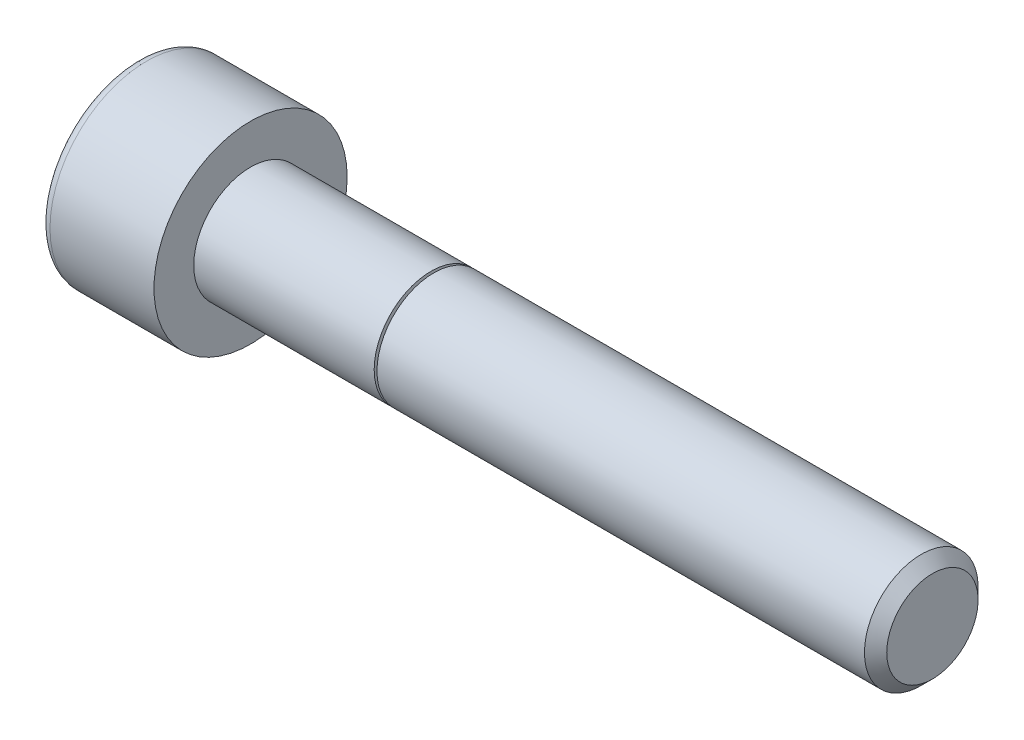
ISO-10303-21;
HEADER;
FILE_DESCRIPTION(('STEP AP214'),'2;1');
FILE_NAME('part.step','',(''),(''),'','','');
FILE_SCHEMA(('AUTOMOTIVE_DESIGN { 1 0 10303 214 1 1 1 1 }'));
ENDSEC;
DATA;
#1=APPLICATION_CONTEXT('core data for automotive mechanical design processes');
#2=APPLICATION_PROTOCOL_DEFINITION('international standard','automotive_design',2000,#1);
#3=PRODUCT_CONTEXT('',#1,'mechanical');
#4=PRODUCT('Part','Part','',(#3));
#5=PRODUCT_RELATED_PRODUCT_CATEGORY('part','',(#4));
#6=PRODUCT_DEFINITION_FORMATION('','',#4);
#7=PRODUCT_DEFINITION_CONTEXT('part definition',#1,'design');
#8=PRODUCT_DEFINITION('design','',#6,#7);
#9=PRODUCT_DEFINITION_SHAPE('','',#8);
#10=(LENGTH_UNIT() NAMED_UNIT(*) SI_UNIT(.MILLI.,.METRE.));
#11=(NAMED_UNIT(*) PLANE_ANGLE_UNIT() SI_UNIT($,.RADIAN.));
#12=(NAMED_UNIT(*) SI_UNIT($,.STERADIAN.) SOLID_ANGLE_UNIT());
#13=UNCERTAINTY_MEASURE_WITH_UNIT(LENGTH_MEASURE(1.E-05),#10,'distance_accuracy_value','');
#14=(GEOMETRIC_REPRESENTATION_CONTEXT(3) GLOBAL_UNCERTAINTY_ASSIGNED_CONTEXT((#13)) GLOBAL_UNIT_ASSIGNED_CONTEXT((#10,
#11,#12)) REPRESENTATION_CONTEXT('',''));
#15=CARTESIAN_POINT('',(0.,0.,0.));
#16=DIRECTION('',(0.,0.,1.));
#17=DIRECTION('',(1.,0.,0.));
#18=AXIS2_PLACEMENT_3D('',#15,#16,#17);
#19=CARTESIAN_POINT('',(30.,-2.04969,2.0095));
#20=DIRECTION('',(1.,0.,0.));
#21=DIRECTION('',(0.,0.,-1.));
#22=AXIS2_PLACEMENT_3D('',#19,#20,#21);
#23=PLANE('',#22);
#24=CARTESIAN_POINT('',(30.,0.,0.));
#25=DIRECTION('',(-1.,0.,0.));
#26=DIRECTION('',(0.,0.,1.));
#27=AXIS2_PLACEMENT_3D('',#24,#25,#26);
#28=CIRCLE('',#27,2.0095);
#29=CARTESIAN_POINT('',(30.,0.,2.0095));
#30=VERTEX_POINT('',#29);
#31=EDGE_CURVE('E20',#30,#30,#28,.T.);
#32=ORIENTED_EDGE('',*,*,#31,.F.);
#33=EDGE_LOOP('',(#32));
#34=FACE_BOUND('',#33,.T.);
#35=ADVANCED_FACE('F16',(#34),#23,.T.);
#36=CARTESIAN_POINT('',(30.,0.,0.));
#37=DIRECTION('',(-1.,0.,0.));
#38=DIRECTION('',(0.,0.,1.));
#39=AXIS2_PLACEMENT_3D('',#36,#37,#38);
#40=CONICAL_SURFACE('',#39,2.0095,0.78539816339745);
#41=ORIENTED_EDGE('',*,*,#31,.T.);
#42=EDGE_LOOP('',(#41));
#43=FACE_BOUND('',#42,.T.);
#44=CARTESIAN_POINT('',(29.5095,0.,0.));
#45=DIRECTION('',(-1.,0.,0.));
#46=DIRECTION('',(0.,0.,1.));
#47=AXIS2_PLACEMENT_3D('',#44,#45,#46);
#48=CIRCLE('',#47,2.5);
#49=CARTESIAN_POINT('',(29.5095,0.,2.5));
#50=VERTEX_POINT('',#49);
#51=EDGE_CURVE('E122',#50,#50,#48,.T.);
#52=ORIENTED_EDGE('',*,*,#51,.F.);
#53=EDGE_LOOP('',(#52));
#54=FACE_BOUND('',#53,.T.);
#55=ADVANCED_FACE('F235',(#43,#54),#40,.T.);
#56=CARTESIAN_POINT('',(29.5095,0.,0.));
#57=DIRECTION('',(-1.,0.,0.));
#58=DIRECTION('',(0.,0.,1.));
#59=AXIS2_PLACEMENT_3D('',#56,#57,#58);
#60=CYLINDRICAL_SURFACE('',#59,2.5);
#61=CARTESIAN_POINT('',(8.0613125,0.,0.));
#62=DIRECTION('',(-1.,0.,0.));
#63=DIRECTION('',(0.,0.,1.));
#64=AXIS2_PLACEMENT_3D('',#61,#62,#63);
#65=CIRCLE('',#64,2.5);
#66=CARTESIAN_POINT('',(8.0613125,0.,2.5));
#67=VERTEX_POINT('',#66);
#68=EDGE_CURVE('E119',#67,#67,#65,.T.);
#69=ORIENTED_EDGE('',*,*,#68,.F.);
#70=EDGE_LOOP('',(#69));
#71=FACE_BOUND('',#70,.T.);
#72=ORIENTED_EDGE('',*,*,#51,.T.);
#73=EDGE_LOOP('',(#72));
#74=FACE_BOUND('',#73,.T.);
#75=ADVANCED_FACE('F229',(#71,#74),#60,.T.);
#76=CARTESIAN_POINT('',(8.,0.,0.));
#77=DIRECTION('',(1.,0.,0.));
#78=DIRECTION('',(0.,0.,-1.));
#79=AXIS2_PLACEMENT_3D('',#76,#77,#78);
#80=CONICAL_SURFACE('',#79,2.0095,1.44644133224814);
#81=CARTESIAN_POINT('',(8.,0.,0.));
#82=DIRECTION('',(-1.,0.,0.));
#83=DIRECTION('',(0.,0.,1.));
#84=AXIS2_PLACEMENT_3D('',#81,#82,#83);
#85=CIRCLE('',#84,2.0095);
#86=CARTESIAN_POINT('',(8.,0.,2.0095));
#87=VERTEX_POINT('',#86);
#88=EDGE_CURVE('E116',#87,#87,#85,.T.);
#89=ORIENTED_EDGE('',*,*,#88,.F.);
#90=EDGE_LOOP('',(#89));
#91=FACE_BOUND('',#90,.T.);
#92=ORIENTED_EDGE('',*,*,#68,.T.);
#93=EDGE_LOOP('',(#92));
#94=FACE_BOUND('',#93,.T.);
#95=ADVANCED_FACE('F223',(#91,#94),#80,.T.);
#96=CARTESIAN_POINT('',(7.9386875,0.,0.));
#97=DIRECTION('',(-1.,0.,0.));
#98=DIRECTION('',(0.,0.,1.));
#99=AXIS2_PLACEMENT_3D('',#96,#97,#98);
#100=CONICAL_SURFACE('',#99,2.5,1.44644133224814);
#101=CARTESIAN_POINT('',(7.9386875,0.,0.));
#102=DIRECTION('',(-1.,0.,0.));
#103=DIRECTION('',(0.,0.,1.));
#104=AXIS2_PLACEMENT_3D('',#101,#102,#103);
#105=CIRCLE('',#104,2.5);
#106=CARTESIAN_POINT('',(7.9386875,0.,2.5));
#107=VERTEX_POINT('',#106);
#108=EDGE_CURVE('E113',#107,#107,#105,.T.);
#109=ORIENTED_EDGE('',*,*,#108,.F.);
#110=EDGE_LOOP('',(#109));
#111=FACE_BOUND('',#110,.T.);
#112=ORIENTED_EDGE('',*,*,#88,.T.);
#113=EDGE_LOOP('',(#112));
#114=FACE_BOUND('',#113,.T.);
#115=ADVANCED_FACE('F218',(#111,#114),#100,.T.);
#116=CARTESIAN_POINT('',(7.9386875,0.,0.));
#117=DIRECTION('',(-1.,0.,0.));
#118=DIRECTION('',(0.,0.,1.));
#119=AXIS2_PLACEMENT_3D('',#116,#117,#118);
#120=CYLINDRICAL_SURFACE('',#119,2.5);
#121=CARTESIAN_POINT('',(0.,0.,0.));
#122=DIRECTION('',(-1.,0.,0.));
#123=DIRECTION('',(0.,0.,1.));
#124=AXIS2_PLACEMENT_3D('',#121,#122,#123);
#125=CIRCLE('',#124,2.5);
#126=CARTESIAN_POINT('',(0.,0.,2.5));
#127=VERTEX_POINT('',#126);
#128=EDGE_CURVE('E92',#127,#127,#125,.T.);
#129=ORIENTED_EDGE('',*,*,#128,.F.);
#130=EDGE_LOOP('',(#129));
#131=FACE_BOUND('',#130,.T.);
#132=ORIENTED_EDGE('',*,*,#108,.T.);
#133=EDGE_LOOP('',(#132));
#134=FACE_BOUND('',#133,.T.);
#135=ADVANCED_FACE('F215',(#131,#134),#120,.T.);
#136=CARTESIAN_POINT('',(-1.9,0.,0.));
#137=DIRECTION('',(-1.,0.,0.));
#138=DIRECTION('',(0.,0.,1.));
#139=AXIS2_PLACEMENT_3D('',#136,#137,#138);
#140=CONICAL_SURFACE('',#139,2.3094010767585,1.0471975511966);
#141=CARTESIAN_POINT('',(-1.9,0.,2.3094010767585));
#142=CARTESIAN_POINT('',(-1.87069554512665,-0.0878878875630438,2.25865898121547));
#143=CARTESIAN_POINT('',(-1.84404467710022,-0.176534422121215,2.20747888062559));
#144=CARTESIAN_POINT('',(-1.79752638740027,-0.355362346686105,2.10423253023943));
#145=CARTESIAN_POINT('',(-1.77767542033809,-0.44554691308464,2.05216444655249));
#146=CARTESIAN_POINT('',(-1.74677595894609,-0.624798433758891,1.94867353283856));
#147=CARTESIAN_POINT('',(-1.73552178759691,-0.713837815616439,1.89726662175463));
#148=CARTESIAN_POINT('',(-1.72208916813045,-0.892335320462004,1.79421103928237));
#149=CARTESIAN_POINT('',(-1.7198995939742,-0.981792795105295,1.74256274221605));
#150=CARTESIAN_POINT('',(-1.72446629015479,-1.14893448970974,1.64606343984337));
#151=CARTESIAN_POINT('',(-1.73010128521626,-1.22664379064383,1.60119795403054));
#152=CARTESIAN_POINT('',(-1.74795730071816,-1.38155614176471,1.5117592664101));
#153=CARTESIAN_POINT('',(-1.76018441476867,-1.45875865655097,1.46718637371614));
#154=CARTESIAN_POINT('',(-1.79074983333835,-1.61399014172453,1.37756343396448));
#155=CARTESIAN_POINT('',(-1.80921764221832,-1.69199947538354,1.33252472417715));
#156=CARTESIAN_POINT('',(-1.85113176083937,-1.84685497000488,1.24311886267203));
#157=CARTESIAN_POINT('',(-1.87456822875222,-1.92370311331472,1.19875056644538));
#158=CARTESIAN_POINT('',(-1.90000000000001,-1.99999999999999,1.15470053837931));
#159=B_SPLINE_CURVE_WITH_KNOTS('',3,(#141,#142,#143,#144,#145,#146,#147,#148,#149,#150,#151,
#152,#153,#154,#155,#156,#157,#158),.UNSPECIFIED.,.F.,.F.,(4,2,2,2,2,2,2,2,4),(0.,
0.317016011556855,0.634793817027109,0.944707606152922,1.25424088889782,1.52370778263188,
1.79342419379439,2.06912162248864,2.34427797351492),.UNSPECIFIED.);
#160=CARTESIAN_POINT('',(-1.9,0.,2.3094010767585));
#161=VERTEX_POINT('',#160);
#162=CARTESIAN_POINT('',(-1.90000000000001,-2.,1.1547005383793));
#163=VERTEX_POINT('',#162);
#164=EDGE_CURVE('E82',#161,#163,#159,.T.);
#165=ORIENTED_EDGE('',*,*,#164,.F.);
#166=CARTESIAN_POINT('',(-1.90000000000002,2.,1.1547005383793));
#167=CARTESIAN_POINT('',(-1.87069554512667,1.91211211243696,1.20544263392233));
#168=CARTESIAN_POINT('',(-1.84404467710023,1.82346557787879,1.25662273451221));
#169=CARTESIAN_POINT('',(-1.79752638740028,1.6446376533139,1.35986908489837));
#170=CARTESIAN_POINT('',(-1.7776754203381,1.55445308691536,1.41193716858531));
#171=CARTESIAN_POINT('',(-1.74677595894609,1.37520156624111,1.51542808229924));
#172=CARTESIAN_POINT('',(-1.73552178759691,1.28616218438356,1.56683499338317));
#173=CARTESIAN_POINT('',(-1.72208916813045,1.10766467953799,1.66989057585543));
#174=CARTESIAN_POINT('',(-1.7198995939742,1.0182072048947,1.72153887292176));
#175=CARTESIAN_POINT('',(-1.72446629015479,0.851065510290257,1.81803817529444));
#176=CARTESIAN_POINT('',(-1.73010128521625,0.773356209356166,1.86290366110727));
#177=CARTESIAN_POINT('',(-1.74795730071815,0.618443858235278,1.95234234872771));
#178=CARTESIAN_POINT('',(-1.76018441476867,0.541241343449025,1.99691524142166));
#179=CARTESIAN_POINT('',(-1.79074983333834,0.386009858275461,2.08653818117332));
#180=CARTESIAN_POINT('',(-1.80921764221831,0.308000524616451,2.13157689096065));
#181=CARTESIAN_POINT('',(-1.85113176083936,0.153145029995107,2.22098275246578));
#182=CARTESIAN_POINT('',(-1.87456822875221,0.0762968866852722,2.26535104869243));
#183=CARTESIAN_POINT('',(-1.9,0.,2.3094010767585));
#184=B_SPLINE_CURVE_WITH_KNOTS('',3,(#166,#167,#168,#169,#170,#171,#172,#173,#174,#175,#176,
#177,#178,#179,#180,#181,#182,#183),.UNSPECIFIED.,.F.,.F.,(4,2,2,2,2,2,2,2,4),(0.,
0.317016011556859,0.634793817027117,0.944707606152934,1.25424088889784,1.5237077826319,
1.7934241937944,2.06912162248865,2.34427797351493),.UNSPECIFIED.);
#185=CARTESIAN_POINT('',(-1.90000000000001,2.,1.15470053837929));
#186=VERTEX_POINT('',#185);
#187=EDGE_CURVE('E79',#186,#161,#184,.T.);
#188=ORIENTED_EDGE('',*,*,#187,.F.);
#189=CARTESIAN_POINT('',(-1.9,2.,-1.15470053837923));
#190=CARTESIAN_POINT('',(-1.87069554512665,2.,-1.05321634729317));
#191=CARTESIAN_POINT('',(-1.84404467710021,2.,-0.950856146113392));
#192=CARTESIAN_POINT('',(-1.79752638740026,2.,-0.744363445341073));
#193=CARTESIAN_POINT('',(-1.77767542033809,2.,-0.640227277967187));
#194=CARTESIAN_POINT('',(-1.74677595894608,2.,-0.433245450539333));
#195=CARTESIAN_POINT('',(-1.7355217875969,2.,-0.330431628371469));
#196=CARTESIAN_POINT('',(-1.72208916813044,2.,-0.124320463426946));
#197=CARTESIAN_POINT('',(-1.71989959397419,2.,-0.0210238692942912));
#198=CARTESIAN_POINT('',(-1.72446629015478,2.,0.171974735451078));
#199=CARTESIAN_POINT('',(-1.73010128521625,2.,0.261705707076751));
#200=CARTESIAN_POINT('',(-1.74795730071815,2.,0.44058308231764));
#201=CARTESIAN_POINT('',(-1.76018441476866,2.,0.529728867705562));
#202=CARTESIAN_POINT('',(-1.79074983333834,2.,0.708974747208891));
#203=CARTESIAN_POINT('',(-1.80921764221831,2.,0.799052166783559));
#204=CARTESIAN_POINT('',(-1.85113176083936,2.,0.977863889793815));
#205=CARTESIAN_POINT('',(-1.87456822875222,2.,1.06660048224713));
#206=CARTESIAN_POINT('',(-1.90000000000001,2.,1.15470053837928));
#207=B_SPLINE_CURVE_WITH_KNOTS('',3,(#189,#190,#191,#192,#193,#194,#195,#196,#197,#198,#199,
#200,#201,#202,#203,#204,#205,#206),.UNSPECIFIED.,.F.,.F.,(4,2,2,2,2,2,2,2,4),(0.,
0.317016011556853,0.634793817027106,0.944707606152917,1.25424088889781,1.52370778263189,
1.7934241937944,2.06912162248866,2.34427797351496),.UNSPECIFIED.);
#208=CARTESIAN_POINT('',(-1.89999999999999,2.,-1.15470053837921));
#209=VERTEX_POINT('',#208);
#210=EDGE_CURVE('E67',#209,#186,#207,.T.);
#211=ORIENTED_EDGE('',*,*,#210,.F.);
#212=CARTESIAN_POINT('',(-1.9,0.,-2.3094010767585));
#213=CARTESIAN_POINT('',(-1.87069554512665,0.0878878875630413,-2.25865898121547));
#214=CARTESIAN_POINT('',(-1.84404467710021,0.17653442212121,-2.20747888062558));
#215=CARTESIAN_POINT('',(-1.79752638740026,0.355362346686095,-2.10423253023942));
#216=CARTESIAN_POINT('',(-1.77767542033808,0.445546913084628,-2.05216444655247));
#217=CARTESIAN_POINT('',(-1.74677595894607,0.624798433758874,-1.94867353283854));
#218=CARTESIAN_POINT('',(-1.73552178759689,0.71383781561642,-1.89726662175461));
#219=CARTESIAN_POINT('',(-1.72208916813043,0.89233532046198,-1.79421103928234));
#220=CARTESIAN_POINT('',(-1.71989959397418,0.981792795105269,-1.74256274221601));
#221=CARTESIAN_POINT('',(-1.72446629015476,1.14893448970971,-1.64606343984333));
#222=CARTESIAN_POINT('',(-1.73010128521623,1.2266437906438,-1.60119795403049));
#223=CARTESIAN_POINT('',(-1.74795730071813,1.3815561417647,-1.51175926641004));
#224=CARTESIAN_POINT('',(-1.76018441476864,1.45875865655095,-1.46718637371607));
#225=CARTESIAN_POINT('',(-1.79074983333831,1.61399014172452,-1.37756343396441));
#226=CARTESIAN_POINT('',(-1.80921764221829,1.69199947538354,-1.33252472417707));
#227=CARTESIAN_POINT('',(-1.85113176083934,1.84685497000489,-1.24311886267194));
#228=CARTESIAN_POINT('',(-1.87456822875219,1.92370311331472,-1.19875056644528));
#229=CARTESIAN_POINT('',(-1.89999999999999,2.,-1.1547005383792));
#230=B_SPLINE_CURVE_WITH_KNOTS('',3,(#212,#213,#214,#215,#216,#217,#218,#219,#220,#221,#222,
#223,#224,#225,#226,#227,#228,#229),.UNSPECIFIED.,.F.,.F.,(4,2,2,2,2,2,2,2,4),(0.,
0.317016011556855,0.634793817027109,0.944707606152921,1.25424088889782,1.5237077826319,
1.79342419379442,2.06912162248868,2.34427797351498),.UNSPECIFIED.);
#231=CARTESIAN_POINT('',(-1.9,0.,-2.3094010767585));
#232=VERTEX_POINT('',#231);
#233=EDGE_CURVE('E134',#232,#209,#230,.T.);
#234=ORIENTED_EDGE('',*,*,#233,.F.);
#235=CARTESIAN_POINT('',(-1.90000000000001,-1.99999999999999,-1.1547005383793));
#236=CARTESIAN_POINT('',(-1.87069554512666,-1.91211211243695,-1.20544263392233));
#237=CARTESIAN_POINT('',(-1.84404467710023,-1.82346557787878,-1.25662273451222));
#238=CARTESIAN_POINT('',(-1.79752638740027,-1.64463765331388,-1.35986908489838));
#239=CARTESIAN_POINT('',(-1.7776754203381,-1.55445308691535,-1.41193716858532));
#240=CARTESIAN_POINT('',(-1.74677595894609,-1.3752015662411,-1.51542808229924));
#241=CARTESIAN_POINT('',(-1.73552178759691,-1.28616218438355,-1.56683499338317));
#242=CARTESIAN_POINT('',(-1.72208916813045,-1.10766467953798,-1.66989057585543));
#243=CARTESIAN_POINT('',(-1.7198995939742,-1.01820720489469,-1.72153887292176));
#244=CARTESIAN_POINT('',(-1.72446629015479,-0.851065510290249,-1.81803817529444));
#245=CARTESIAN_POINT('',(-1.73010128521626,-0.773356209356158,-1.86290366110727));
#246=CARTESIAN_POINT('',(-1.74795730071816,-0.618443858235273,-1.95234234872771));
#247=CARTESIAN_POINT('',(-1.76018441476867,-0.541241343449019,-1.99691524142167));
#248=CARTESIAN_POINT('',(-1.79074983333834,-0.386009858275457,-2.08653818117332));
#249=CARTESIAN_POINT('',(-1.80921764221831,-0.308000524616448,-2.13157689096065));
#250=CARTESIAN_POINT('',(-1.85113176083936,-0.153145029995106,-2.22098275246578));
#251=CARTESIAN_POINT('',(-1.87456822875221,-0.0762968866852709,-2.26535104869243));
#252=CARTESIAN_POINT('',(-1.9,0.,-2.3094010767585));
#253=B_SPLINE_CURVE_WITH_KNOTS('',3,(#235,#236,#237,#238,#239,#240,#241,#242,#243,#244,#245,
#246,#247,#248,#249,#250,#251,#252),.UNSPECIFIED.,.F.,.F.,(4,2,2,2,2,2,2,2,4),(0.,
0.317016011556858,0.634793817027115,0.944707606152931,1.25424088889783,1.52370778263189,
1.79342419379439,2.06912162248864,2.34427797351492),.UNSPECIFIED.);
#254=CARTESIAN_POINT('',(-1.90000000000001,-2.,-1.1547005383793));
#255=VERTEX_POINT('',#254);
#256=EDGE_CURVE('E142',#255,#232,#253,.T.);
#257=ORIENTED_EDGE('',*,*,#256,.F.);
#258=CARTESIAN_POINT('',(-1.90000000000001,-2.,1.15470053837929));
#259=CARTESIAN_POINT('',(-1.87069554512666,-2.,1.05321634729323));
#260=CARTESIAN_POINT('',(-1.84404467710023,-2.,0.950856146113455));
#261=CARTESIAN_POINT('',(-1.79752638740027,-2.,0.744363445341134));
#262=CARTESIAN_POINT('',(-1.7776754203381,-2.,0.640227277967246));
#263=CARTESIAN_POINT('',(-1.74677595894609,-2.,0.43324545053939));
#264=CARTESIAN_POINT('',(-1.73552178759691,-2.,0.330431628371524));
#265=CARTESIAN_POINT('',(-1.72208916813044,-2.,0.124320463426999));
#266=CARTESIAN_POINT('',(-1.71989959397419,-2.,0.0210238692943427));
#267=CARTESIAN_POINT('',(-1.72446629015478,-2.,-0.171974735451032));
#268=CARTESIAN_POINT('',(-1.73010128521624,-2.,-0.261705707076711));
#269=CARTESIAN_POINT('',(-1.74795730071814,-2.,-0.440583082317611));
#270=CARTESIAN_POINT('',(-1.76018441476866,-2.,-0.529728867705538));
#271=CARTESIAN_POINT('',(-1.79074983333833,-2.,-0.708974747208878));
#272=CARTESIAN_POINT('',(-1.80921764221831,-2.,-0.799052166783552));
#273=CARTESIAN_POINT('',(-1.85113176083936,-2.,-0.977863889793819));
#274=CARTESIAN_POINT('',(-1.87456822875222,-2.,-1.06660048224714));
#275=CARTESIAN_POINT('',(-1.90000000000001,-2.,-1.15470053837929));
#276=B_SPLINE_CURVE_WITH_KNOTS('',3,(#258,#259,#260,#261,#262,#263,#264,#265,#266,#267,#268,
#269,#270,#271,#272,#273,#274,#275),.UNSPECIFIED.,.F.,.F.,(4,2,2,2,2,2,2,2,4),(0.,
0.317016011556858,0.634793817027115,0.944707606152931,1.25424088889783,1.52370778263192,
1.79342419379445,2.06912162248873,2.34427797351504),.UNSPECIFIED.);
#277=EDGE_CURVE('E184',#163,#255,#276,.T.);
#278=ORIENTED_EDGE('',*,*,#277,.F.);
#279=EDGE_LOOP('',(#165,#188,#211,#234,#257,#278));
#280=FACE_BOUND('',#279,.T.);
#281=CARTESIAN_POINT('',(-0.56666666666667,0.,0.));
#282=VERTEX_POINT('',#281);
#283=VERTEX_LOOP('',#282);
#284=FACE_BOUND('',#283,.T.);
#285=ADVANCED_FACE('F80',(#280,#284),#140,.F.);
#286=CARTESIAN_POINT('',(0.,-4.335,4.25));
#287=DIRECTION('',(1.,0.,0.));
#288=DIRECTION('',(0.,0.,-1.));
#289=AXIS2_PLACEMENT_3D('',#286,#287,#288);
#290=PLANE('',#289);
#291=CARTESIAN_POINT('',(0.,0.,0.));
#292=DIRECTION('',(1.,0.,0.));
#293=DIRECTION('',(0.,0.,-1.));
#294=AXIS2_PLACEMENT_3D('',#291,#292,#293);
#295=CIRCLE('',#294,4.25);
#296=CARTESIAN_POINT('',(0.,0.,-4.25));
#297=VERTEX_POINT('',#296);
#298=EDGE_CURVE('E107',#297,#297,#295,.F.);
#299=ORIENTED_EDGE('',*,*,#298,.F.);
#300=EDGE_LOOP('',(#299));
#301=FACE_BOUND('',#300,.T.);
#302=ORIENTED_EDGE('',*,*,#128,.T.);
#303=EDGE_LOOP('',(#302));
#304=FACE_BOUND('',#303,.T.);
#305=ADVANCED_FACE('F213',(#301,#304),#290,.T.);
#306=CARTESIAN_POINT('',(-5.,2.,-1.1547005383793));
#307=DIRECTION('',(0.,-1.,0.));
#308=DIRECTION('',(1.,0.,0.));
#309=AXIS2_PLACEMENT_3D('',#306,#307,#308);
#310=PLANE('',#309);
#311=DIRECTION('',(0.,0.,1.));
#312=VECTOR('',#311,1.);
#313=CARTESIAN_POINT('',(-4.99999999995,2.,0.));
#314=LINE('',#313,#312);
#315=CARTESIAN_POINT('',(-4.99999999995,2.,-1.15470053837925));
#316=VERTEX_POINT('',#315);
#317=CARTESIAN_POINT('',(-4.99999999995,2.,1.1547005383793));
#318=VERTEX_POINT('',#317);
#319=EDGE_CURVE('E72',#316,#318,#314,.T.);
#320=ORIENTED_EDGE('',*,*,#319,.F.);
#321=DIRECTION('',(-1.,0.,0.));
#322=VECTOR('',#321,1.);
#323=CARTESIAN_POINT('',(-3.28333333333335,2.,-1.1547005383792));
#324=LINE('',#323,#322);
#325=EDGE_CURVE('E90',#209,#316,#324,.T.);
#326=ORIENTED_EDGE('',*,*,#325,.F.);
#327=ORIENTED_EDGE('',*,*,#210,.T.);
#328=DIRECTION('',(1.,0.,0.));
#329=VECTOR('',#328,1.);
#330=CARTESIAN_POINT('',(-3.28333333333335,2.,1.1547005383793));
#331=LINE('',#330,#329);
#332=EDGE_CURVE('E86',#318,#186,#331,.T.);
#333=ORIENTED_EDGE('',*,*,#332,.F.);
#334=EDGE_LOOP('',(#320,#326,#327,#333));
#335=FACE_BOUND('',#334,.T.);
#336=ADVANCED_FACE('F88',(#335),#310,.T.);
#337=CARTESIAN_POINT('',(-5.,2.,1.1547005383793));
#338=DIRECTION('',(0.,-0.499999999999983,-0.866025403784448));
#339=DIRECTION('',(1.,0.,0.));
#340=AXIS2_PLACEMENT_3D('',#337,#338,#339);
#341=PLANE('',#340);
#342=DIRECTION('',(0.,-0.866025403784448,0.499999999999983));
#343=VECTOR('',#342,1.);
#344=CARTESIAN_POINT('',(-4.99999999995,2.,1.1547005383793));
#345=LINE('',#344,#343);
#346=CARTESIAN_POINT('',(-4.99999999995,0.,2.3094010767585));
#347=VERTEX_POINT('',#346);
#348=EDGE_CURVE('E96',#318,#347,#345,.T.);
#349=ORIENTED_EDGE('',*,*,#348,.F.);
#350=ORIENTED_EDGE('',*,*,#332,.T.);
#351=ORIENTED_EDGE('',*,*,#187,.T.);
#352=DIRECTION('',(1.,0.,0.));
#353=VECTOR('',#352,1.);
#354=CARTESIAN_POINT('',(-3.28333333333335,0.,2.3094010767585));
#355=LINE('',#354,#353);
#356=EDGE_CURVE('E98',#347,#161,#355,.T.);
#357=ORIENTED_EDGE('',*,*,#356,.F.);
#358=EDGE_LOOP('',(#349,#350,#351,#357));
#359=FACE_BOUND('',#358,.T.);
#360=ADVANCED_FACE('F94',(#359),#341,.T.);
#361=CARTESIAN_POINT('',(-5.,0.,2.3094010767585));
#362=DIRECTION('',(0.,0.499999999999983,-0.866025403784448));
#363=DIRECTION('',(1.,0.,0.));
#364=AXIS2_PLACEMENT_3D('',#361,#362,#363);
#365=PLANE('',#364);
#366=DIRECTION('',(0.,-0.866025403784448,-0.499999999999983));
#367=VECTOR('',#366,1.);
#368=CARTESIAN_POINT('',(-4.99999999995,0.,2.3094010767585));
#369=LINE('',#368,#367);
#370=CARTESIAN_POINT('',(-4.99999999995,-2.,1.1547005383793));
#371=VERTEX_POINT('',#370);
#372=EDGE_CURVE('E112',#347,#371,#369,.T.);
#373=ORIENTED_EDGE('',*,*,#372,.F.);
#374=ORIENTED_EDGE('',*,*,#356,.T.);
#375=ORIENTED_EDGE('',*,*,#164,.T.);
#376=DIRECTION('',(1.,0.,0.));
#377=VECTOR('',#376,1.);
#378=CARTESIAN_POINT('',(-3.28333333333335,-2.,1.1547005383793));
#379=LINE('',#378,#377);
#380=EDGE_CURVE('E180',#371,#163,#379,.T.);
#381=ORIENTED_EDGE('',*,*,#380,.F.);
#382=EDGE_LOOP('',(#373,#374,#375,#381));
#383=FACE_BOUND('',#382,.T.);
#384=ADVANCED_FACE('F195',(#383),#365,.T.);
#385=CARTESIAN_POINT('',(-5.,-2.,1.1547005383793));
#386=DIRECTION('',(0.,1.,0.));
#387=DIRECTION('',(1.,0.,0.));
#388=AXIS2_PLACEMENT_3D('',#385,#386,#387);
#389=PLANE('',#388);
#390=DIRECTION('',(0.,0.,-1.));
#391=VECTOR('',#390,1.);
#392=CARTESIAN_POINT('',(-4.99999999995,-2.,0.));
#393=LINE('',#392,#391);
#394=CARTESIAN_POINT('',(-4.99999999995,-2.,-1.1547005383793));
#395=VERTEX_POINT('',#394);
#396=EDGE_CURVE('E108',#371,#395,#393,.T.);
#397=ORIENTED_EDGE('',*,*,#396,.F.);
#398=ORIENTED_EDGE('',*,*,#380,.T.);
#399=ORIENTED_EDGE('',*,*,#277,.T.);
#400=DIRECTION('',(1.,0.,0.));
#401=VECTOR('',#400,1.);
#402=CARTESIAN_POINT('',(-3.28333333333335,-2.,-1.1547005383793));
#403=LINE('',#402,#401);
#404=EDGE_CURVE('E141',#395,#255,#403,.T.);
#405=ORIENTED_EDGE('',*,*,#404,.F.);
#406=EDGE_LOOP('',(#397,#398,#399,#405));
#407=FACE_BOUND('',#406,.T.);
#408=ADVANCED_FACE('F192',(#407),#389,.T.);
#409=CARTESIAN_POINT('',(-5.,-2.,-1.1547005383793));
#410=DIRECTION('',(0.,0.499999999999983,0.866025403784448));
#411=DIRECTION('',(1.,0.,0.));
#412=AXIS2_PLACEMENT_3D('',#409,#410,#411);
#413=PLANE('',#412);
#414=DIRECTION('',(0.,0.866025403784448,-0.499999999999983));
#415=VECTOR('',#414,1.);
#416=CARTESIAN_POINT('',(-4.99999999995,-2.,-1.1547005383793));
#417=LINE('',#416,#415);
#418=CARTESIAN_POINT('',(-4.99999999995,0.,-2.3094010767585));
#419=VERTEX_POINT('',#418);
#420=EDGE_CURVE('E111',#395,#419,#417,.T.);
#421=ORIENTED_EDGE('',*,*,#420,.F.);
#422=ORIENTED_EDGE('',*,*,#404,.T.);
#423=ORIENTED_EDGE('',*,*,#256,.T.);
#424=DIRECTION('',(1.,0.,0.));
#425=VECTOR('',#424,1.);
#426=CARTESIAN_POINT('',(-3.28333333333335,0.,-2.3094010767585));
#427=LINE('',#426,#425);
#428=EDGE_CURVE('E35',#419,#232,#427,.T.);
#429=ORIENTED_EDGE('',*,*,#428,.F.);
#430=EDGE_LOOP('',(#421,#422,#423,#429));
#431=FACE_BOUND('',#430,.T.);
#432=ADVANCED_FACE('F156',(#431),#413,.T.);
#433=CARTESIAN_POINT('',(-5.,0.,-2.3094010767585));
#434=DIRECTION('',(0.,-0.500000000000015,0.86602540378443));
#435=DIRECTION('',(1.,0.,0.));
#436=AXIS2_PLACEMENT_3D('',#433,#434,#435);
#437=PLANE('',#436);
#438=DIRECTION('',(0.,0.866025403784448,0.499999999999983));
#439=VECTOR('',#438,1.);
#440=CARTESIAN_POINT('',(-4.99999999995,0.,-2.3094010767585));
#441=LINE('',#440,#439);
#442=EDGE_CURVE('E105',#419,#316,#441,.T.);
#443=ORIENTED_EDGE('',*,*,#442,.F.);
#444=ORIENTED_EDGE('',*,*,#428,.T.);
#445=ORIENTED_EDGE('',*,*,#233,.T.);
#446=ORIENTED_EDGE('',*,*,#325,.T.);
#447=EDGE_LOOP('',(#443,#444,#445,#446));
#448=FACE_BOUND('',#447,.T.);
#449=ADVANCED_FACE('F151',(#448),#437,.T.);
#450=CARTESIAN_POINT('',(-4.575,0.,0.));
#451=DIRECTION('',(1.,0.,0.));
#452=DIRECTION('',(0.,0.,-1.));
#453=AXIS2_PLACEMENT_3D('',#450,#451,#452);
#454=CYLINDRICAL_SURFACE('',#453,4.25);
#455=ORIENTED_EDGE('',*,*,#298,.T.);
#456=EDGE_LOOP('',(#455));
#457=FACE_BOUND('',#456,.T.);
#458=CARTESIAN_POINT('',(-4.575,0.,0.));
#459=DIRECTION('',(-1.,0.,0.));
#460=DIRECTION('',(0.,0.,1.));
#461=AXIS2_PLACEMENT_3D('',#458,#459,#460);
#462=CIRCLE('',#461,4.2499999999);
#463=CARTESIAN_POINT('',(-4.575,0.,4.2499999999));
#464=VERTEX_POINT('',#463);
#465=EDGE_CURVE('E26',#464,#464,#462,.T.);
#466=ORIENTED_EDGE('',*,*,#465,.F.);
#467=EDGE_LOOP('',(#466));
#468=FACE_BOUND('',#467,.T.);
#469=ADVANCED_FACE('F155',(#457,#468),#454,.T.);
#470=CARTESIAN_POINT('',(-4.99999999995,-3.9015,-3.825));
#471=DIRECTION('',(-1.,0.,0.));
#472=DIRECTION('',(0.,0.,1.));
#473=AXIS2_PLACEMENT_3D('',#470,#471,#472);
#474=PLANE('',#473);
#475=ORIENTED_EDGE('',*,*,#420,.T.);
#476=ORIENTED_EDGE('',*,*,#442,.T.);
#477=ORIENTED_EDGE('',*,*,#319,.T.);
#478=ORIENTED_EDGE('',*,*,#348,.T.);
#479=ORIENTED_EDGE('',*,*,#372,.T.);
#480=ORIENTED_EDGE('',*,*,#396,.T.);
#481=EDGE_LOOP('',(#475,#476,#477,#478,#479,#480));
#482=FACE_BOUND('',#481,.T.);
#483=CARTESIAN_POINT('',(-4.9999999999,0.,0.));
#484=DIRECTION('',(1.,0.,0.));
#485=DIRECTION('',(0.,0.,-1.));
#486=AXIS2_PLACEMENT_3D('',#483,#484,#485);
#487=CIRCLE('',#486,3.82499999995044);
#488=CARTESIAN_POINT('',(-4.9999999999,0.,-3.82499999995044));
#489=VERTEX_POINT('',#488);
#490=EDGE_CURVE('E10',#489,#489,#487,.T.);
#491=ORIENTED_EDGE('',*,*,#490,.F.);
#492=EDGE_LOOP('',(#491));
#493=FACE_BOUND('',#492,.T.);
#494=ADVANCED_FACE('F161',(#482,#493),#474,.T.);
#495=CARTESIAN_POINT('',(-4.5749999999,0.,0.));
#496=DIRECTION('',(1.,0.,0.));
#497=DIRECTION('',(0.,0.,-1.));
#498=AXIS2_PLACEMENT_3D('',#495,#496,#497);
#499=TOROIDAL_SURFACE('',#498,3.8249999999,0.425000000000002);
#500=ORIENTED_EDGE('',*,*,#490,.T.);
#501=EDGE_LOOP('',(#500));
#502=FACE_BOUND('',#501,.T.);
#503=ORIENTED_EDGE('',*,*,#465,.T.);
#504=EDGE_LOOP('',(#503));
#505=FACE_BOUND('',#504,.T.);
#506=ADVANCED_FACE('F18',(#502,#505),#499,.T.);
#507=CLOSED_SHELL('',(#35,#55,#75,#95,#115,#135,#285,#305,#336,#360,#384,#408,#432,#449,#469,
#494,#506));
#508=MANIFOLD_SOLID_BREP('B1',#507);
#509=ADVANCED_BREP_SHAPE_REPRESENTATION('',(#18,#508),#14);
#510=SHAPE_DEFINITION_REPRESENTATION(#9,#509);
ENDSEC;
END-ISO-10303-21;
